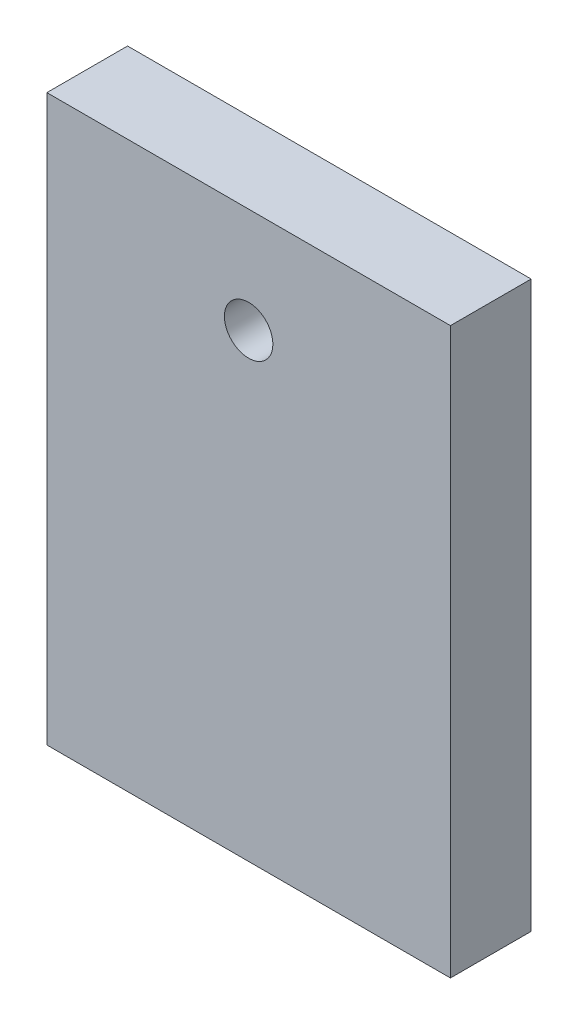
ISO-10303-21;
HEADER;
FILE_DESCRIPTION(('STEP AP214'),'2;1');
FILE_NAME('part.step','',(''),(''),'','','');
FILE_SCHEMA(('AUTOMOTIVE_DESIGN { 1 0 10303 214 1 1 1 1 }'));
ENDSEC;
DATA;
#1=APPLICATION_CONTEXT('core data for automotive mechanical design processes');
#2=APPLICATION_PROTOCOL_DEFINITION('international standard','automotive_design',2000,#1);
#3=PRODUCT_CONTEXT('',#1,'mechanical');
#4=PRODUCT('Part','Part','',(#3));
#5=PRODUCT_RELATED_PRODUCT_CATEGORY('part','',(#4));
#6=PRODUCT_DEFINITION_FORMATION('','',#4);
#7=PRODUCT_DEFINITION_CONTEXT('part definition',#1,'design');
#8=PRODUCT_DEFINITION('design','',#6,#7);
#9=PRODUCT_DEFINITION_SHAPE('','',#8);
#10=(LENGTH_UNIT() NAMED_UNIT(*) SI_UNIT(.MILLI.,.METRE.));
#11=(NAMED_UNIT(*) PLANE_ANGLE_UNIT() SI_UNIT($,.RADIAN.));
#12=(NAMED_UNIT(*) SI_UNIT($,.STERADIAN.) SOLID_ANGLE_UNIT());
#13=UNCERTAINTY_MEASURE_WITH_UNIT(LENGTH_MEASURE(1.E-05),#10,'distance_accuracy_value','');
#14=(GEOMETRIC_REPRESENTATION_CONTEXT(3) GLOBAL_UNCERTAINTY_ASSIGNED_CONTEXT((#13)) GLOBAL_UNIT_ASSIGNED_CONTEXT((#10,
#11,#12)) REPRESENTATION_CONTEXT('',''));
#15=CARTESIAN_POINT('',(0.,0.,0.));
#16=DIRECTION('',(0.,0.,1.));
#17=DIRECTION('',(1.,0.,0.));
#18=AXIS2_PLACEMENT_3D('',#15,#16,#17);
#19=CARTESIAN_POINT('',(12.5,-17.5,5.));
#20=DIRECTION('',(-1.,0.,0.));
#21=DIRECTION('',(0.,0.,1.));
#22=AXIS2_PLACEMENT_3D('',#19,#20,#21);
#23=PLANE('',#22);
#24=DIRECTION('',(0.,1.,0.));
#25=VECTOR('',#24,1.);
#26=CARTESIAN_POINT('',(12.5,-17.5,0.));
#27=LINE('',#26,#25);
#28=CARTESIAN_POINT('',(12.5,-17.5,0.));
#29=VERTEX_POINT('',#28);
#30=CARTESIAN_POINT('',(12.5,17.5,0.));
#31=VERTEX_POINT('',#30);
#32=EDGE_CURVE('E107',#29,#31,#27,.T.);
#33=ORIENTED_EDGE('',*,*,#32,.T.);
#34=DIRECTION('',(0.,0.,-1.));
#35=VECTOR('',#34,1.);
#36=CARTESIAN_POINT('',(12.5,17.5,5.));
#37=LINE('',#36,#35);
#38=CARTESIAN_POINT('',(12.5,17.5,5.));
#39=VERTEX_POINT('',#38);
#40=EDGE_CURVE('E11',#39,#31,#37,.T.);
#41=ORIENTED_EDGE('',*,*,#40,.F.);
#42=DIRECTION('',(0.,1.,0.));
#43=VECTOR('',#42,1.);
#44=CARTESIAN_POINT('',(12.5,-17.5,5.));
#45=LINE('',#44,#43);
#46=CARTESIAN_POINT('',(12.5,-17.5,5.));
#47=VERTEX_POINT('',#46);
#48=EDGE_CURVE('E91',#47,#39,#45,.T.);
#49=ORIENTED_EDGE('',*,*,#48,.F.);
#50=DIRECTION('',(0.,0.,-1.));
#51=VECTOR('',#50,1.);
#52=CARTESIAN_POINT('',(12.5,-17.5,5.));
#53=LINE('',#52,#51);
#54=EDGE_CURVE('E103',#47,#29,#53,.T.);
#55=ORIENTED_EDGE('',*,*,#54,.T.);
#56=EDGE_LOOP('',(#33,#41,#49,#55));
#57=FACE_BOUND('',#56,.T.);
#58=ADVANCED_FACE('F39',(#57),#23,.F.);
#59=CARTESIAN_POINT('',(-12.5,17.5,5.));
#60=DIRECTION('',(0.,-1.,0.));
#61=DIRECTION('',(0.,0.,-1.));
#62=AXIS2_PLACEMENT_3D('',#59,#60,#61);
#63=PLANE('',#62);
#64=DIRECTION('',(-1.,0.,0.));
#65=VECTOR('',#64,1.);
#66=CARTESIAN_POINT('',(-12.5,17.5,0.));
#67=LINE('',#66,#65);
#68=CARTESIAN_POINT('',(-12.5,17.5,0.));
#69=VERTEX_POINT('',#68);
#70=EDGE_CURVE('E96',#31,#69,#67,.T.);
#71=ORIENTED_EDGE('',*,*,#70,.T.);
#72=DIRECTION('',(0.,0.,-1.));
#73=VECTOR('',#72,1.);
#74=CARTESIAN_POINT('',(-12.5,17.5,5.));
#75=LINE('',#74,#73);
#76=CARTESIAN_POINT('',(-12.5,17.5,5.));
#77=VERTEX_POINT('',#76);
#78=EDGE_CURVE('E48',#77,#69,#75,.T.);
#79=ORIENTED_EDGE('',*,*,#78,.F.);
#80=DIRECTION('',(-1.,0.,0.));
#81=VECTOR('',#80,1.);
#82=CARTESIAN_POINT('',(-12.5,17.5,5.));
#83=LINE('',#82,#81);
#84=EDGE_CURVE('E86',#39,#77,#83,.T.);
#85=ORIENTED_EDGE('',*,*,#84,.F.);
#86=ORIENTED_EDGE('',*,*,#40,.T.);
#87=EDGE_LOOP('',(#71,#79,#85,#86));
#88=FACE_BOUND('',#87,.T.);
#89=ADVANCED_FACE('F95',(#88),#63,.F.);
#90=CARTESIAN_POINT('',(-12.5,-17.5,5.));
#91=DIRECTION('',(1.,0.,0.));
#92=DIRECTION('',(0.,0.,-1.));
#93=AXIS2_PLACEMENT_3D('',#90,#91,#92);
#94=PLANE('',#93);
#95=DIRECTION('',(0.,-1.,0.));
#96=VECTOR('',#95,1.);
#97=CARTESIAN_POINT('',(-12.5,-17.5,0.));
#98=LINE('',#97,#96);
#99=CARTESIAN_POINT('',(-12.5,-17.5,0.));
#100=VERTEX_POINT('',#99);
#101=EDGE_CURVE('E73',#69,#100,#98,.T.);
#102=ORIENTED_EDGE('',*,*,#101,.T.);
#103=DIRECTION('',(0.,0.,-1.));
#104=VECTOR('',#103,1.);
#105=CARTESIAN_POINT('',(-12.5,-17.5,5.));
#106=LINE('',#105,#104);
#107=CARTESIAN_POINT('',(-12.5,-17.5,5.));
#108=VERTEX_POINT('',#107);
#109=EDGE_CURVE('E98',#108,#100,#106,.T.);
#110=ORIENTED_EDGE('',*,*,#109,.F.);
#111=DIRECTION('',(0.,-1.,0.));
#112=VECTOR('',#111,1.);
#113=CARTESIAN_POINT('',(-12.5,-17.5,5.));
#114=LINE('',#113,#112);
#115=EDGE_CURVE('E89',#77,#108,#114,.T.);
#116=ORIENTED_EDGE('',*,*,#115,.F.);
#117=ORIENTED_EDGE('',*,*,#78,.T.);
#118=EDGE_LOOP('',(#102,#110,#116,#117));
#119=FACE_BOUND('',#118,.T.);
#120=ADVANCED_FACE('F99',(#119),#94,.F.);
#121=CARTESIAN_POINT('',(-12.5,-17.5,5.));
#122=DIRECTION('',(0.,1.,0.));
#123=DIRECTION('',(0.,0.,1.));
#124=AXIS2_PLACEMENT_3D('',#121,#122,#123);
#125=PLANE('',#124);
#126=DIRECTION('',(1.,0.,0.));
#127=VECTOR('',#126,1.);
#128=CARTESIAN_POINT('',(-12.5,-17.5,0.));
#129=LINE('',#128,#127);
#130=EDGE_CURVE('E79',#100,#29,#129,.T.);
#131=ORIENTED_EDGE('',*,*,#130,.T.);
#132=ORIENTED_EDGE('',*,*,#54,.F.);
#133=DIRECTION('',(1.,0.,0.));
#134=VECTOR('',#133,1.);
#135=CARTESIAN_POINT('',(-12.5,-17.5,5.));
#136=LINE('',#135,#134);
#137=EDGE_CURVE('E56',#108,#47,#136,.T.);
#138=ORIENTED_EDGE('',*,*,#137,.F.);
#139=ORIENTED_EDGE('',*,*,#109,.T.);
#140=EDGE_LOOP('',(#131,#132,#138,#139));
#141=FACE_BOUND('',#140,.T.);
#142=ADVANCED_FACE('F121',(#141),#125,.F.);
#143=CARTESIAN_POINT('',(0.,0.,5.));
#144=DIRECTION('',(0.,0.,-1.));
#145=DIRECTION('',(-1.,0.,0.));
#146=AXIS2_PLACEMENT_3D('',#143,#144,#145);
#147=PLANE('',#146);
#148=CARTESIAN_POINT('',(0.,11.,5.));
#149=DIRECTION('',(0.,0.,1.));
#150=DIRECTION('',(1.,0.,0.));
#151=AXIS2_PLACEMENT_3D('',#148,#149,#150);
#152=CIRCLE('',#151,1.5);
#153=CARTESIAN_POINT('',(1.5,11.,5.));
#154=VERTEX_POINT('',#153);
#155=EDGE_CURVE('E128',#154,#154,#152,.T.);
#156=ORIENTED_EDGE('',*,*,#155,.F.);
#157=EDGE_LOOP('',(#156));
#158=FACE_BOUND('',#157,.T.);
#159=ORIENTED_EDGE('',*,*,#48,.T.);
#160=ORIENTED_EDGE('',*,*,#84,.T.);
#161=ORIENTED_EDGE('',*,*,#115,.T.);
#162=ORIENTED_EDGE('',*,*,#137,.T.);
#163=EDGE_LOOP('',(#159,#160,#161,#162));
#164=FACE_BOUND('',#163,.T.);
#165=ADVANCED_FACE('F87',(#158,#164),#147,.F.);
#166=CARTESIAN_POINT('',(0.,0.,0.));
#167=DIRECTION('',(0.,0.,-1.));
#168=DIRECTION('',(-1.,0.,0.));
#169=AXIS2_PLACEMENT_3D('',#166,#167,#168);
#170=PLANE('',#169);
#171=CARTESIAN_POINT('',(0.,11.,0.));
#172=DIRECTION('',(0.,0.,1.));
#173=DIRECTION('',(1.,0.,0.));
#174=AXIS2_PLACEMENT_3D('',#171,#172,#173);
#175=CIRCLE('',#174,1.5);
#176=CARTESIAN_POINT('',(1.5,11.,0.));
#177=VERTEX_POINT('',#176);
#178=EDGE_CURVE('E111',#177,#177,#175,.T.);
#179=ORIENTED_EDGE('',*,*,#178,.T.);
#180=EDGE_LOOP('',(#179));
#181=FACE_BOUND('',#180,.T.);
#182=ORIENTED_EDGE('',*,*,#32,.F.);
#183=ORIENTED_EDGE('',*,*,#130,.F.);
#184=ORIENTED_EDGE('',*,*,#101,.F.);
#185=ORIENTED_EDGE('',*,*,#70,.F.);
#186=EDGE_LOOP('',(#182,#183,#184,#185));
#187=FACE_BOUND('',#186,.T.);
#188=ADVANCED_FACE('F124',(#181,#187),#170,.T.);
#189=CARTESIAN_POINT('',(0.,11.,0.));
#190=DIRECTION('',(0.,0.,1.));
#191=DIRECTION('',(1.,0.,0.));
#192=AXIS2_PLACEMENT_3D('',#189,#190,#191);
#193=CYLINDRICAL_SURFACE('',#192,1.5);
#194=ORIENTED_EDGE('',*,*,#178,.F.);
#195=EDGE_LOOP('',(#194));
#196=FACE_BOUND('',#195,.T.);
#197=ORIENTED_EDGE('',*,*,#155,.T.);
#198=EDGE_LOOP('',(#197));
#199=FACE_BOUND('',#198,.T.);
#200=ADVANCED_FACE('F137',(#196,#199),#193,.F.);
#201=CLOSED_SHELL('',(#58,#89,#120,#142,#165,#188,#200));
#202=MANIFOLD_SOLID_BREP('B2',#201);
#203=ADVANCED_BREP_SHAPE_REPRESENTATION('',(#18,#202),#14);
#204=SHAPE_DEFINITION_REPRESENTATION(#9,#203);
ENDSEC;
END-ISO-10303-21;
